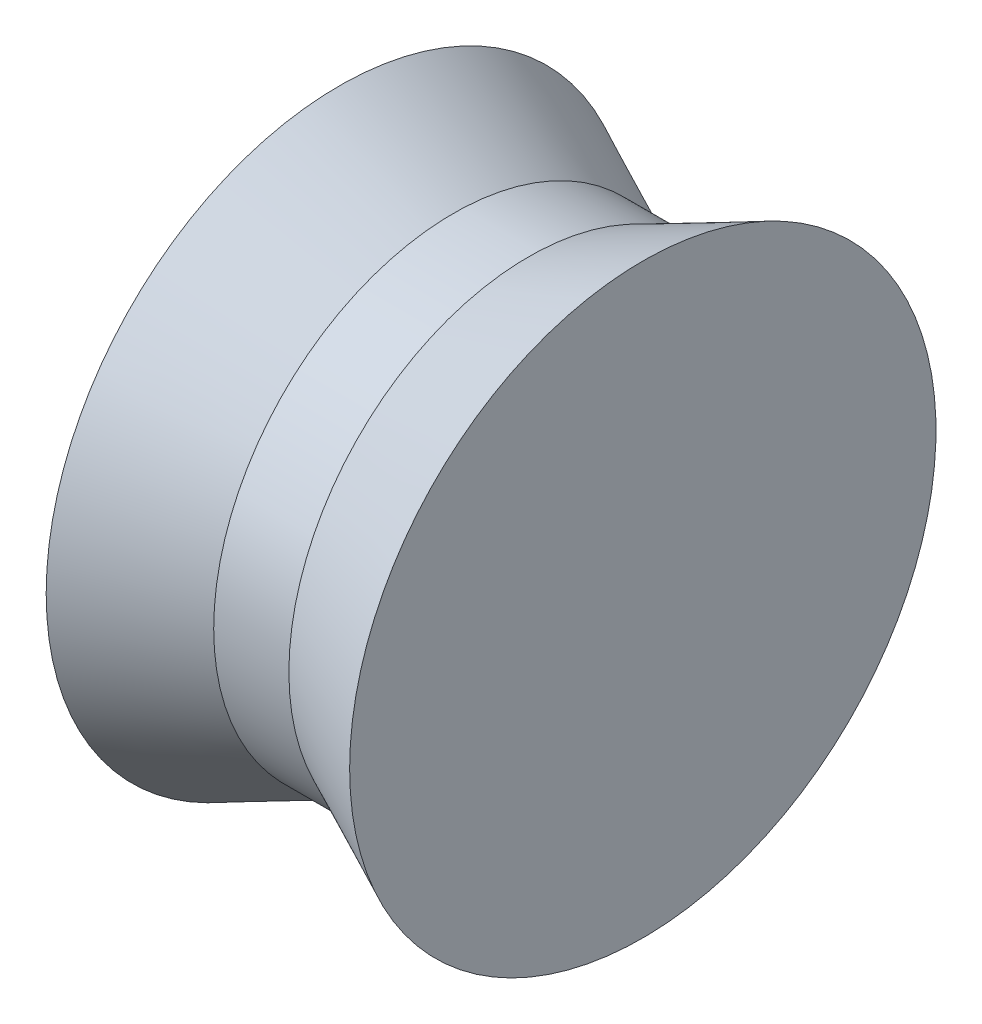
ISO-10303-21;
HEADER;
FILE_DESCRIPTION(('STEP AP214'),'2;1');
FILE_NAME('part.step','',(''),(''),'','','');
FILE_SCHEMA(('AUTOMOTIVE_DESIGN { 1 0 10303 214 1 1 1 1 }'));
ENDSEC;
DATA;
#1=APPLICATION_CONTEXT('core data for automotive mechanical design processes');
#2=APPLICATION_PROTOCOL_DEFINITION('international standard','automotive_design',2000,#1);
#3=PRODUCT_CONTEXT('',#1,'mechanical');
#4=PRODUCT('Part','Part','',(#3));
#5=PRODUCT_RELATED_PRODUCT_CATEGORY('part','',(#4));
#6=PRODUCT_DEFINITION_FORMATION('','',#4);
#7=PRODUCT_DEFINITION_CONTEXT('part definition',#1,'design');
#8=PRODUCT_DEFINITION('design','',#6,#7);
#9=PRODUCT_DEFINITION_SHAPE('','',#8);
#10=(LENGTH_UNIT() NAMED_UNIT(*) SI_UNIT(.MILLI.,.METRE.));
#11=(NAMED_UNIT(*) PLANE_ANGLE_UNIT() SI_UNIT($,.RADIAN.));
#12=(NAMED_UNIT(*) SI_UNIT($,.STERADIAN.) SOLID_ANGLE_UNIT());
#13=UNCERTAINTY_MEASURE_WITH_UNIT(LENGTH_MEASURE(1.E-05),#10,'distance_accuracy_value','');
#14=(GEOMETRIC_REPRESENTATION_CONTEXT(3) GLOBAL_UNCERTAINTY_ASSIGNED_CONTEXT((#13)) GLOBAL_UNIT_ASSIGNED_CONTEXT((#10,
#11,#12)) REPRESENTATION_CONTEXT('',''));
#15=CARTESIAN_POINT('',(0.,0.,0.));
#16=DIRECTION('',(0.,0.,1.));
#17=DIRECTION('',(1.,0.,0.));
#18=AXIS2_PLACEMENT_3D('',#15,#16,#17);
#19=CARTESIAN_POINT('',(-25.1250010196732,48.5496242370966,0.));
#20=DIRECTION('',(1.,0.,0.));
#21=DIRECTION('',(0.,0.,-1.));
#22=AXIS2_PLACEMENT_3D('',#19,#20,#21);
#23=PLANE('',#22);
#24=CARTESIAN_POINT('',(-25.1250010196732,0.,0.));
#25=DIRECTION('',(-1.,0.,0.));
#26=DIRECTION('',(0.,0.,1.));
#27=AXIS2_PLACEMENT_3D('',#24,#25,#26);
#28=CIRCLE('',#27,48.5496242370966);
#29=CARTESIAN_POINT('',(-25.1250010196732,0.,48.5496242370966));
#30=VERTEX_POINT('',#29);
#31=EDGE_CURVE('E51',#30,#30,#28,.T.);
#32=ORIENTED_EDGE('',*,*,#31,.T.);
#33=EDGE_LOOP('',(#32));
#34=FACE_BOUND('',#33,.T.);
#35=ADVANCED_FACE('F37',(#34),#23,.F.);
#36=CARTESIAN_POINT('',(25.1250010196732,0.,0.));
#37=DIRECTION('',(-1.,0.,0.));
#38=DIRECTION('',(0.,0.,1.));
#39=AXIS2_PLACEMENT_3D('',#36,#37,#38);
#40=PLANE('',#39);
#41=CARTESIAN_POINT('',(25.1250010196732,0.,0.));
#42=DIRECTION('',(-1.,0.,0.));
#43=DIRECTION('',(0.,0.,1.));
#44=AXIS2_PLACEMENT_3D('',#41,#42,#43);
#45=CIRCLE('',#44,48.5496242370966);
#46=CARTESIAN_POINT('',(25.1250010196732,0.,48.5496242370966));
#47=VERTEX_POINT('',#46);
#48=EDGE_CURVE('E10',#47,#47,#45,.T.);
#49=ORIENTED_EDGE('',*,*,#48,.F.);
#50=EDGE_LOOP('',(#49));
#51=FACE_BOUND('',#50,.T.);
#52=ADVANCED_FACE('F71',(#51),#40,.F.);
#53=CARTESIAN_POINT('',(25.1250010196732,0.,0.));
#54=DIRECTION('',(1.,0.,0.));
#55=DIRECTION('',(0.,0.,-1.));
#56=AXIS2_PLACEMENT_3D('',#53,#54,#55);
#57=CONICAL_SURFACE('',#56,48.5496242370966,0.437483578575929);
#58=CARTESIAN_POINT('',(6.22554835998414,0.,0.));
#59=DIRECTION('',(-1.,0.,0.));
#60=DIRECTION('',(0.,0.,1.));
#61=AXIS2_PLACEMENT_3D('',#58,#59,#60);
#62=CIRCLE('',#61,39.7101610135589);
#63=CARTESIAN_POINT('',(6.22554835998414,0.,39.7101610135589));
#64=VERTEX_POINT('',#63);
#65=EDGE_CURVE('E43',#64,#64,#62,.T.);
#66=ORIENTED_EDGE('',*,*,#65,.F.);
#67=EDGE_LOOP('',(#66));
#68=FACE_BOUND('',#67,.T.);
#69=ORIENTED_EDGE('',*,*,#48,.T.);
#70=EDGE_LOOP('',(#69));
#71=FACE_BOUND('',#70,.T.);
#72=ADVANCED_FACE('F66',(#68,#71),#57,.T.);
#73=CARTESIAN_POINT('',(-25.1250010196732,0.,0.));
#74=DIRECTION('',(-1.,0.,0.));
#75=DIRECTION('',(0.,0.,1.));
#76=AXIS2_PLACEMENT_3D('',#73,#74,#75);
#77=CYLINDRICAL_SURFACE('',#76,39.7101610135589);
#78=CARTESIAN_POINT('',(-6.22554835998414,0.,0.));
#79=DIRECTION('',(-1.,0.,0.));
#80=DIRECTION('',(0.,0.,1.));
#81=AXIS2_PLACEMENT_3D('',#78,#79,#80);
#82=CIRCLE('',#81,39.7101610135589);
#83=CARTESIAN_POINT('',(-6.22554835998414,0.,39.7101610135589));
#84=VERTEX_POINT('',#83);
#85=EDGE_CURVE('E47',#84,#84,#82,.T.);
#86=ORIENTED_EDGE('',*,*,#85,.F.);
#87=EDGE_LOOP('',(#86));
#88=FACE_BOUND('',#87,.T.);
#89=ORIENTED_EDGE('',*,*,#65,.T.);
#90=EDGE_LOOP('',(#89));
#91=FACE_BOUND('',#90,.T.);
#92=ADVANCED_FACE('F61',(#88,#91),#77,.T.);
#93=CARTESIAN_POINT('',(-6.22554835998414,0.,0.));
#94=DIRECTION('',(-1.,0.,0.));
#95=DIRECTION('',(0.,0.,1.));
#96=AXIS2_PLACEMENT_3D('',#93,#94,#95);
#97=CONICAL_SURFACE('',#96,39.7101610135589,0.437483578575929);
#98=ORIENTED_EDGE('',*,*,#31,.F.);
#99=EDGE_LOOP('',(#98));
#100=FACE_BOUND('',#99,.T.);
#101=ORIENTED_EDGE('',*,*,#85,.T.);
#102=EDGE_LOOP('',(#101));
#103=FACE_BOUND('',#102,.T.);
#104=ADVANCED_FACE('F58',(#100,#103),#97,.T.);
#105=CLOSED_SHELL('',(#35,#52,#72,#92,#104));
#106=MANIFOLD_SOLID_BREP('B2',#105);
#107=ADVANCED_BREP_SHAPE_REPRESENTATION('',(#18,#106),#14);
#108=SHAPE_DEFINITION_REPRESENTATION(#9,#107);
ENDSEC;
END-ISO-10303-21;
